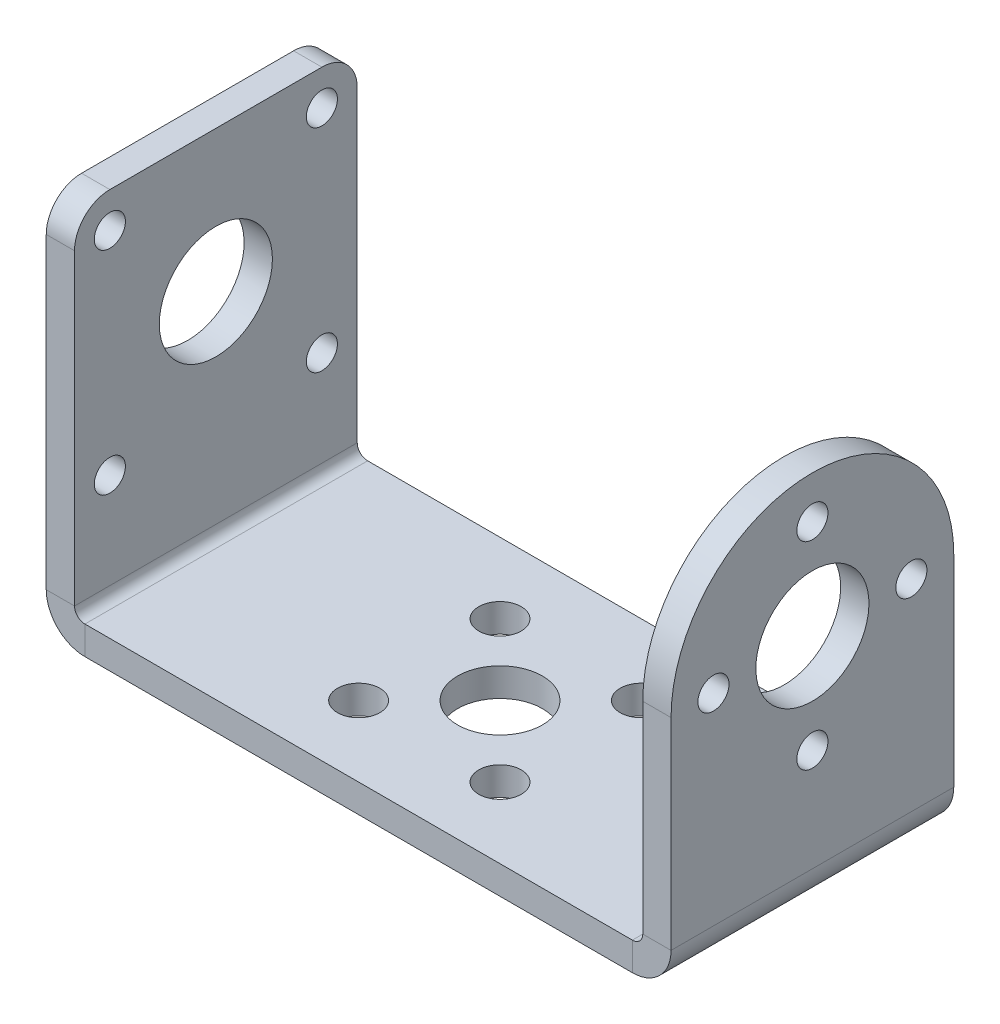
ISO-10303-21;
HEADER;
FILE_DESCRIPTION(('STEP AP214'),'2;1');
FILE_NAME('part.step','',(''),(''),'','','');
FILE_SCHEMA(('AUTOMOTIVE_DESIGN { 1 0 10303 214 1 1 1 1 }'));
ENDSEC;
DATA;
#1=APPLICATION_CONTEXT('core data for automotive mechanical design processes');
#2=APPLICATION_PROTOCOL_DEFINITION('international standard','automotive_design',2000,#1);
#3=PRODUCT_CONTEXT('',#1,'mechanical');
#4=PRODUCT('Part','Part','',(#3));
#5=PRODUCT_RELATED_PRODUCT_CATEGORY('part','',(#4));
#6=PRODUCT_DEFINITION_FORMATION('','',#4);
#7=PRODUCT_DEFINITION_CONTEXT('part definition',#1,'design');
#8=PRODUCT_DEFINITION('design','',#6,#7);
#9=PRODUCT_DEFINITION_SHAPE('','',#8);
#10=(LENGTH_UNIT() NAMED_UNIT(*) SI_UNIT(.MILLI.,.METRE.));
#11=(NAMED_UNIT(*) PLANE_ANGLE_UNIT() SI_UNIT($,.RADIAN.));
#12=(NAMED_UNIT(*) SI_UNIT($,.STERADIAN.) SOLID_ANGLE_UNIT());
#13=UNCERTAINTY_MEASURE_WITH_UNIT(LENGTH_MEASURE(1.E-05),#10,'distance_accuracy_value','');
#14=(GEOMETRIC_REPRESENTATION_CONTEXT(3) GLOBAL_UNCERTAINTY_ASSIGNED_CONTEXT((#13)) GLOBAL_UNIT_ASSIGNED_CONTEXT((#10,
#11,#12)) REPRESENTATION_CONTEXT('',''));
#15=CARTESIAN_POINT('',(0.,0.,0.));
#16=DIRECTION('',(0.,0.,1.));
#17=DIRECTION('',(1.,0.,0.));
#18=AXIS2_PLACEMENT_3D('',#15,#16,#17);
#19=CARTESIAN_POINT('',(-22.1000000000001,22.5,7.5));
#20=DIRECTION('',(1.,0.,0.));
#21=DIRECTION('',(0.,1.,0.));
#22=AXIS2_PLACEMENT_3D('',#19,#20,#21);
#23=CYLINDRICAL_SURFACE('',#22,2.5);
#24=DIRECTION('',(1.,0.,0.));
#25=VECTOR('',#24,1.);
#26=CARTESIAN_POINT('',(-22.1000000000001,25.,7.5));
#27=LINE('',#26,#25);
#28=CARTESIAN_POINT('',(-22.1000000000001,25.,7.5));
#29=VERTEX_POINT('',#28);
#30=CARTESIAN_POINT('',(-20.1000000000001,25.,7.5));
#31=VERTEX_POINT('',#30);
#32=EDGE_CURVE('E382',#29,#31,#27,.T.);
#33=ORIENTED_EDGE('',*,*,#32,.F.);
#34=CARTESIAN_POINT('',(-22.1000000000001,22.5,7.5));
#35=DIRECTION('',(1.,0.,0.));
#36=DIRECTION('',(0.,1.,0.));
#37=AXIS2_PLACEMENT_3D('',#34,#35,#36);
#38=CIRCLE('',#37,2.5);
#39=CARTESIAN_POINT('',(-22.1000000000001,22.5,10.));
#40=VERTEX_POINT('',#39);
#41=EDGE_CURVE('E155',#40,#29,#38,.F.);
#42=ORIENTED_EDGE('',*,*,#41,.F.);
#43=DIRECTION('',(1.,0.,0.));
#44=VECTOR('',#43,1.);
#45=CARTESIAN_POINT('',(-22.1000000000001,22.5,10.));
#46=LINE('',#45,#44);
#47=CARTESIAN_POINT('',(-20.1000000000001,22.5,10.));
#48=VERTEX_POINT('',#47);
#49=EDGE_CURVE('E385',#48,#40,#46,.F.);
#50=ORIENTED_EDGE('',*,*,#49,.F.);
#51=CARTESIAN_POINT('',(-20.1000000000001,22.5,7.5));
#52=DIRECTION('',(1.,0.,0.));
#53=DIRECTION('',(0.,1.,0.));
#54=AXIS2_PLACEMENT_3D('',#51,#52,#53);
#55=CIRCLE('',#54,2.5);
#56=EDGE_CURVE('E13',#31,#48,#55,.T.);
#57=ORIENTED_EDGE('',*,*,#56,.F.);
#58=EDGE_LOOP('',(#33,#42,#50,#57));
#59=FACE_BOUND('',#58,.T.);
#60=ADVANCED_FACE('F148',(#59),#23,.T.);
#61=CARTESIAN_POINT('',(-22.1000000000001,22.5,-7.5));
#62=DIRECTION('',(-1.,0.,0.));
#63=DIRECTION('',(0.,-1.,0.));
#64=AXIS2_PLACEMENT_3D('',#61,#62,#63);
#65=CYLINDRICAL_SURFACE('',#64,2.5);
#66=DIRECTION('',(-1.,0.,0.));
#67=VECTOR('',#66,1.);
#68=CARTESIAN_POINT('',(-22.1000000000001,25.,-7.5));
#69=LINE('',#68,#67);
#70=CARTESIAN_POINT('',(-20.1000000000001,25.,-7.5));
#71=VERTEX_POINT('',#70);
#72=CARTESIAN_POINT('',(-22.1000000000001,25.,-7.5));
#73=VERTEX_POINT('',#72);
#74=EDGE_CURVE('E368',#71,#73,#69,.T.);
#75=ORIENTED_EDGE('',*,*,#74,.F.);
#76=CARTESIAN_POINT('',(-20.1000000000001,22.5,-7.5));
#77=DIRECTION('',(1.,0.,0.));
#78=DIRECTION('',(0.,1.,0.));
#79=AXIS2_PLACEMENT_3D('',#76,#77,#78);
#80=CIRCLE('',#79,2.5);
#81=CARTESIAN_POINT('',(-20.1000000000001,22.5,-10.));
#82=VERTEX_POINT('',#81);
#83=EDGE_CURVE('E377',#82,#71,#80,.T.);
#84=ORIENTED_EDGE('',*,*,#83,.F.);
#85=DIRECTION('',(-1.,0.,0.));
#86=VECTOR('',#85,1.);
#87=CARTESIAN_POINT('',(-22.1000000000001,22.5,-10.));
#88=LINE('',#87,#86);
#89=CARTESIAN_POINT('',(-22.1000000000001,22.5,-10.));
#90=VERTEX_POINT('',#89);
#91=EDGE_CURVE('E374',#90,#82,#88,.F.);
#92=ORIENTED_EDGE('',*,*,#91,.F.);
#93=CARTESIAN_POINT('',(-22.1000000000001,22.5,-7.5));
#94=DIRECTION('',(1.,0.,0.));
#95=DIRECTION('',(0.,1.,0.));
#96=AXIS2_PLACEMENT_3D('',#93,#94,#95);
#97=CIRCLE('',#96,2.5);
#98=EDGE_CURVE('E380',#73,#90,#97,.F.);
#99=ORIENTED_EDGE('',*,*,#98,.F.);
#100=EDGE_LOOP('',(#75,#84,#92,#99));
#101=FACE_BOUND('',#100,.T.);
#102=ADVANCED_FACE('F396',(#101),#65,.T.);
#103=CARTESIAN_POINT('',(22.1,0.,0.));
#104=DIRECTION('',(1.,0.,0.));
#105=DIRECTION('',(0.,1.,0.));
#106=AXIS2_PLACEMENT_3D('',#103,#104,#105);
#107=PLANE('',#106);
#108=CARTESIAN_POINT('',(22.1000000000001,15.,-7.));
#109=DIRECTION('',(1.,0.,0.));
#110=DIRECTION('',(0.,1.,0.));
#111=AXIS2_PLACEMENT_3D('',#108,#109,#110);
#112=CIRCLE('',#111,1.1);
#113=CARTESIAN_POINT('',(22.1000000000001,16.1,-7.));
#114=VERTEX_POINT('',#113);
#115=EDGE_CURVE('E885',#114,#114,#112,.T.);
#116=ORIENTED_EDGE('',*,*,#115,.F.);
#117=EDGE_LOOP('',(#116));
#118=FACE_BOUND('',#117,.T.);
#119=CARTESIAN_POINT('',(22.1000000000001,22.,0.));
#120=DIRECTION('',(1.,0.,0.));
#121=DIRECTION('',(0.,1.,0.));
#122=AXIS2_PLACEMENT_3D('',#119,#120,#121);
#123=CIRCLE('',#122,1.1);
#124=CARTESIAN_POINT('',(22.1000000000001,23.1,0.));
#125=VERTEX_POINT('',#124);
#126=EDGE_CURVE('E891',#125,#125,#123,.T.);
#127=ORIENTED_EDGE('',*,*,#126,.F.);
#128=EDGE_LOOP('',(#127));
#129=FACE_BOUND('',#128,.T.);
#130=CARTESIAN_POINT('',(22.1000000000001,15.,0.));
#131=DIRECTION('',(1.,0.,0.));
#132=DIRECTION('',(0.,1.,0.));
#133=AXIS2_PLACEMENT_3D('',#130,#131,#132);
#134=CIRCLE('',#133,4.);
#135=CARTESIAN_POINT('',(22.1000000000001,19.,0.));
#136=VERTEX_POINT('',#135);
#137=EDGE_CURVE('E897',#136,#136,#134,.T.);
#138=ORIENTED_EDGE('',*,*,#137,.F.);
#139=EDGE_LOOP('',(#138));
#140=FACE_BOUND('',#139,.T.);
#141=CARTESIAN_POINT('',(22.1000000000001,15.,7.));
#142=DIRECTION('',(1.,0.,0.));
#143=DIRECTION('',(0.,1.,0.));
#144=AXIS2_PLACEMENT_3D('',#141,#142,#143);
#145=CIRCLE('',#144,1.1);
#146=CARTESIAN_POINT('',(22.1000000000001,16.1,7.));
#147=VERTEX_POINT('',#146);
#148=EDGE_CURVE('E880',#147,#147,#145,.T.);
#149=ORIENTED_EDGE('',*,*,#148,.F.);
#150=EDGE_LOOP('',(#149));
#151=FACE_BOUND('',#150,.T.);
#152=CARTESIAN_POINT('',(22.1,8.,0.));
#153=DIRECTION('',(1.,0.,0.));
#154=DIRECTION('',(0.,1.,0.));
#155=AXIS2_PLACEMENT_3D('',#152,#153,#154);
#156=CIRCLE('',#155,1.1);
#157=CARTESIAN_POINT('',(22.1,9.1,0.));
#158=VERTEX_POINT('',#157);
#159=EDGE_CURVE('E884',#158,#158,#156,.T.);
#160=ORIENTED_EDGE('',*,*,#159,.F.);
#161=EDGE_LOOP('',(#160));
#162=FACE_BOUND('',#161,.T.);
#163=DIRECTION('',(0.,-1.,0.));
#164=VECTOR('',#163,1.);
#165=CARTESIAN_POINT('',(22.1,0.,-10.));
#166=LINE('',#165,#164);
#167=CARTESIAN_POINT('',(22.1,0.73659999999999,-10.));
#168=VERTEX_POINT('',#167);
#169=CARTESIAN_POINT('',(22.1000000000001,15.,-10.));
#170=VERTEX_POINT('',#169);
#171=EDGE_CURVE('E262',#168,#170,#166,.F.);
#172=ORIENTED_EDGE('',*,*,#171,.T.);
#173=CARTESIAN_POINT('',(22.1000000000001,15.,0.));
#174=DIRECTION('',(1.,0.,0.));
#175=DIRECTION('',(0.,1.,0.));
#176=AXIS2_PLACEMENT_3D('',#173,#174,#175);
#177=CIRCLE('',#176,10.);
#178=CARTESIAN_POINT('',(22.1000000000001,15.,10.));
#179=VERTEX_POINT('',#178);
#180=EDGE_CURVE('E246',#179,#170,#177,.F.);
#181=ORIENTED_EDGE('',*,*,#180,.F.);
#182=DIRECTION('',(0.,1.,0.));
#183=VECTOR('',#182,1.);
#184=CARTESIAN_POINT('',(22.1,0.,10.));
#185=LINE('',#184,#183);
#186=CARTESIAN_POINT('',(22.1,0.73659999999999,10.));
#187=VERTEX_POINT('',#186);
#188=EDGE_CURVE('E271',#179,#187,#185,.F.);
#189=ORIENTED_EDGE('',*,*,#188,.T.);
#190=DIRECTION('',(0.,0.,-1.));
#191=VECTOR('',#190,1.);
#192=CARTESIAN_POINT('',(22.1,0.73659999999999,0.));
#193=LINE('',#192,#191);
#194=EDGE_CURVE('E270',#187,#168,#193,.T.);
#195=ORIENTED_EDGE('',*,*,#194,.T.);
#196=EDGE_LOOP('',(#172,#181,#189,#195));
#197=FACE_BOUND('',#196,.T.);
#198=ADVANCED_FACE('F268',(#118,#129,#140,#151,#162,#197),#107,.T.);
#199=CARTESIAN_POINT('',(20.1,0.,0.));
#200=DIRECTION('',(1.,0.,0.));
#201=DIRECTION('',(0.,1.,0.));
#202=AXIS2_PLACEMENT_3D('',#199,#200,#201);
#203=PLANE('',#202);
#204=CARTESIAN_POINT('',(20.1000000000001,15.,-7.));
#205=DIRECTION('',(1.,0.,0.));
#206=DIRECTION('',(0.,1.,0.));
#207=AXIS2_PLACEMENT_3D('',#204,#205,#206);
#208=CIRCLE('',#207,1.1);
#209=CARTESIAN_POINT('',(20.1000000000001,16.1,-7.));
#210=VERTEX_POINT('',#209);
#211=EDGE_CURVE('E881',#210,#210,#208,.T.);
#212=ORIENTED_EDGE('',*,*,#211,.T.);
#213=EDGE_LOOP('',(#212));
#214=FACE_BOUND('',#213,.T.);
#215=CARTESIAN_POINT('',(20.1000000000001,22.,0.));
#216=DIRECTION('',(1.,0.,0.));
#217=DIRECTION('',(0.,1.,0.));
#218=AXIS2_PLACEMENT_3D('',#215,#216,#217);
#219=CIRCLE('',#218,1.1);
#220=CARTESIAN_POINT('',(20.1000000000001,23.1,0.));
#221=VERTEX_POINT('',#220);
#222=EDGE_CURVE('E888',#221,#221,#219,.T.);
#223=ORIENTED_EDGE('',*,*,#222,.T.);
#224=EDGE_LOOP('',(#223));
#225=FACE_BOUND('',#224,.T.);
#226=CARTESIAN_POINT('',(20.1000000000001,15.,0.));
#227=DIRECTION('',(1.,0.,0.));
#228=DIRECTION('',(0.,1.,0.));
#229=AXIS2_PLACEMENT_3D('',#226,#227,#228);
#230=CIRCLE('',#229,4.);
#231=CARTESIAN_POINT('',(20.1000000000001,19.,0.));
#232=VERTEX_POINT('',#231);
#233=EDGE_CURVE('E894',#232,#232,#230,.T.);
#234=ORIENTED_EDGE('',*,*,#233,.T.);
#235=EDGE_LOOP('',(#234));
#236=FACE_BOUND('',#235,.T.);
#237=CARTESIAN_POINT('',(20.1000000000001,15.,7.));
#238=DIRECTION('',(1.,0.,0.));
#239=DIRECTION('',(0.,1.,0.));
#240=AXIS2_PLACEMENT_3D('',#237,#238,#239);
#241=CIRCLE('',#240,1.1);
#242=CARTESIAN_POINT('',(20.1000000000001,16.1,7.));
#243=VERTEX_POINT('',#242);
#244=EDGE_CURVE('E900',#243,#243,#241,.T.);
#245=ORIENTED_EDGE('',*,*,#244,.T.);
#246=EDGE_LOOP('',(#245));
#247=FACE_BOUND('',#246,.T.);
#248=CARTESIAN_POINT('',(20.1,8.00000000000001,0.));
#249=DIRECTION('',(1.,0.,0.));
#250=DIRECTION('',(0.,1.,0.));
#251=AXIS2_PLACEMENT_3D('',#248,#249,#250);
#252=CIRCLE('',#251,1.1);
#253=CARTESIAN_POINT('',(20.1,9.10000000000001,0.));
#254=VERTEX_POINT('',#253);
#255=EDGE_CURVE('E289',#254,#254,#252,.T.);
#256=ORIENTED_EDGE('',*,*,#255,.T.);
#257=EDGE_LOOP('',(#256));
#258=FACE_BOUND('',#257,.T.);
#259=CARTESIAN_POINT('',(20.1000000000001,15.,0.));
#260=DIRECTION('',(1.,0.,0.));
#261=DIRECTION('',(0.,1.,0.));
#262=AXIS2_PLACEMENT_3D('',#259,#260,#261);
#263=CIRCLE('',#262,10.);
#264=CARTESIAN_POINT('',(20.1000000000001,15.,10.));
#265=VERTEX_POINT('',#264);
#266=CARTESIAN_POINT('',(20.1000000000001,15.,-10.));
#267=VERTEX_POINT('',#266);
#268=EDGE_CURVE('E256',#265,#267,#263,.F.);
#269=ORIENTED_EDGE('',*,*,#268,.T.);
#270=DIRECTION('',(0.,1.,0.));
#271=VECTOR('',#270,1.);
#272=CARTESIAN_POINT('',(20.1,0.,-10.));
#273=LINE('',#272,#271);
#274=CARTESIAN_POINT('',(20.1,0.736599999999997,-10.));
#275=VERTEX_POINT('',#274);
#276=EDGE_CURVE('E264',#275,#267,#273,.T.);
#277=ORIENTED_EDGE('',*,*,#276,.F.);
#278=DIRECTION('',(0.,0.,1.));
#279=VECTOR('',#278,1.);
#280=CARTESIAN_POINT('',(20.1,0.736599999999997,10.));
#281=LINE('',#280,#279);
#282=CARTESIAN_POINT('',(20.1,0.736599999999997,10.));
#283=VERTEX_POINT('',#282);
#284=EDGE_CURVE('E284',#283,#275,#281,.F.);
#285=ORIENTED_EDGE('',*,*,#284,.F.);
#286=DIRECTION('',(0.,-1.,0.));
#287=VECTOR('',#286,1.);
#288=CARTESIAN_POINT('',(20.1000000000001,25.,10.));
#289=LINE('',#288,#287);
#290=EDGE_CURVE('E272',#265,#283,#289,.T.);
#291=ORIENTED_EDGE('',*,*,#290,.F.);
#292=EDGE_LOOP('',(#269,#277,#285,#291));
#293=FACE_BOUND('',#292,.T.);
#294=ADVANCED_FACE('F439',(#214,#225,#236,#247,#258,#293),#203,.F.);
#295=CARTESIAN_POINT('',(22.1000000000001,25.,10.));
#296=DIRECTION('',(0.,0.,-1.));
#297=DIRECTION('',(-1.,0.,0.));
#298=AXIS2_PLACEMENT_3D('',#295,#296,#297);
#299=PLANE('',#298);
#300=DIRECTION('',(-1.,0.,0.));
#301=VECTOR('',#300,1.);
#302=CARTESIAN_POINT('',(20.1000000000001,15.,10.));
#303=LINE('',#302,#301);
#304=EDGE_CURVE('E252',#265,#179,#303,.F.);
#305=ORIENTED_EDGE('',*,*,#304,.F.);
#306=ORIENTED_EDGE('',*,*,#290,.T.);
#307=DIRECTION('',(-1.,0.,0.));
#308=VECTOR('',#307,1.);
#309=CARTESIAN_POINT('',(22.1,0.73659999999999,10.));
#310=LINE('',#309,#308);
#311=EDGE_CURVE('E286',#283,#187,#310,.F.);
#312=ORIENTED_EDGE('',*,*,#311,.T.);
#313=ORIENTED_EDGE('',*,*,#188,.F.);
#314=EDGE_LOOP('',(#305,#306,#312,#313));
#315=FACE_BOUND('',#314,.T.);
#316=ADVANCED_FACE('F458',(#315),#299,.F.);
#317=CARTESIAN_POINT('',(0.,-2.,0.));
#318=DIRECTION('',(0.,1.,0.));
#319=DIRECTION('',(0.,0.,1.));
#320=AXIS2_PLACEMENT_3D('',#317,#318,#319);
#321=PLANE('',#320);
#322=CARTESIAN_POINT('',(-5.,-2.,5.));
#323=DIRECTION('',(0.,-1.,0.));
#324=DIRECTION('',(0.,0.,-1.));
#325=AXIS2_PLACEMENT_3D('',#322,#323,#324);
#326=CIRCLE('',#325,1.5);
#327=CARTESIAN_POINT('',(-5.,-2.,3.5));
#328=VERTEX_POINT('',#327);
#329=EDGE_CURVE('E821',#328,#328,#326,.T.);
#330=ORIENTED_EDGE('',*,*,#329,.F.);
#331=EDGE_LOOP('',(#330));
#332=FACE_BOUND('',#331,.T.);
#333=CARTESIAN_POINT('',(4.99999999999942,-2.,5.00000000000289));
#334=DIRECTION('',(0.,-1.,0.));
#335=DIRECTION('',(0.,0.,-1.));
#336=AXIS2_PLACEMENT_3D('',#333,#334,#335);
#337=CIRCLE('',#336,1.5);
#338=CARTESIAN_POINT('',(4.99999999999942,-2.,3.50000000000289));
#339=VERTEX_POINT('',#338);
#340=EDGE_CURVE('E827',#339,#339,#337,.T.);
#341=ORIENTED_EDGE('',*,*,#340,.F.);
#342=EDGE_LOOP('',(#341));
#343=FACE_BOUND('',#342,.T.);
#344=CARTESIAN_POINT('',(5.00000000000231,-2.,-4.99999999999653));
#345=DIRECTION('',(0.,-1.,0.));
#346=DIRECTION('',(0.,0.,-1.));
#347=AXIS2_PLACEMENT_3D('',#344,#345,#346);
#348=CIRCLE('',#347,1.5);
#349=CARTESIAN_POINT('',(5.00000000000231,-2.,-6.49999999999653));
#350=VERTEX_POINT('',#349);
#351=EDGE_CURVE('E835',#350,#350,#348,.T.);
#352=ORIENTED_EDGE('',*,*,#351,.F.);
#353=EDGE_LOOP('',(#352));
#354=FACE_BOUND('',#353,.T.);
#355=CARTESIAN_POINT('',(-4.99999999999711,-2.,-4.99999999999942));
#356=DIRECTION('',(0.,-1.,0.));
#357=DIRECTION('',(0.,0.,-1.));
#358=AXIS2_PLACEMENT_3D('',#355,#356,#357);
#359=CIRCLE('',#358,1.5);
#360=CARTESIAN_POINT('',(-4.99999999999711,-2.,-6.49999999999942));
#361=VERTEX_POINT('',#360);
#362=EDGE_CURVE('E841',#361,#361,#359,.T.);
#363=ORIENTED_EDGE('',*,*,#362,.F.);
#364=EDGE_LOOP('',(#363));
#365=FACE_BOUND('',#364,.T.);
#366=CARTESIAN_POINT('',(0.,-2.,0.));
#367=DIRECTION('',(0.,-1.,0.));
#368=DIRECTION('',(0.,0.,-1.));
#369=AXIS2_PLACEMENT_3D('',#366,#367,#368);
#370=CIRCLE('',#369,3.);
#371=CARTESIAN_POINT('',(0.,-2.,-3.));
#372=VERTEX_POINT('',#371);
#373=EDGE_CURVE('E825',#372,#372,#370,.T.);
#374=ORIENTED_EDGE('',*,*,#373,.F.);
#375=EDGE_LOOP('',(#374));
#376=FACE_BOUND('',#375,.T.);
#377=DIRECTION('',(0.,0.,-1.));
#378=VECTOR('',#377,1.);
#379=CARTESIAN_POINT('',(19.3634,-2.,-10.));
#380=LINE('',#379,#378);
#381=CARTESIAN_POINT('',(19.3634,-2.,-10.));
#382=VERTEX_POINT('',#381);
#383=CARTESIAN_POINT('',(19.3634,-2.,10.));
#384=VERTEX_POINT('',#383);
#385=EDGE_CURVE('E290',#382,#384,#380,.F.);
#386=ORIENTED_EDGE('',*,*,#385,.T.);
#387=DIRECTION('',(1.,0.,0.));
#388=VECTOR('',#387,1.);
#389=CARTESIAN_POINT('',(-22.1,-2.,10.));
#390=LINE('',#389,#388);
#391=CARTESIAN_POINT('',(-19.3634,-2.,10.));
#392=VERTEX_POINT('',#391);
#393=EDGE_CURVE('E364',#392,#384,#390,.T.);
#394=ORIENTED_EDGE('',*,*,#393,.F.);
#395=DIRECTION('',(0.,0.,1.));
#396=VECTOR('',#395,1.);
#397=CARTESIAN_POINT('',(-19.3634,-2.,10.));
#398=LINE('',#397,#396);
#399=CARTESIAN_POINT('',(-19.3634,-2.,-10.));
#400=VERTEX_POINT('',#399);
#401=EDGE_CURVE('E338',#392,#400,#398,.F.);
#402=ORIENTED_EDGE('',*,*,#401,.T.);
#403=DIRECTION('',(-1.,0.,0.));
#404=VECTOR('',#403,1.);
#405=CARTESIAN_POINT('',(-22.1,-2.,-10.));
#406=LINE('',#405,#404);
#407=EDGE_CURVE('E362',#382,#400,#406,.T.);
#408=ORIENTED_EDGE('',*,*,#407,.F.);
#409=EDGE_LOOP('',(#386,#394,#402,#408));
#410=FACE_BOUND('',#409,.T.);
#411=ADVANCED_FACE('F454',(#332,#343,#354,#365,#376,#410),#321,.F.);
#412=CARTESIAN_POINT('',(0.,0.,0.));
#413=DIRECTION('',(0.,1.,0.));
#414=DIRECTION('',(0.,0.,1.));
#415=AXIS2_PLACEMENT_3D('',#412,#413,#414);
#416=PLANE('',#415);
#417=CARTESIAN_POINT('',(-5.,0.,5.));
#418=DIRECTION('',(0.,1.,0.));
#419=DIRECTION('',(0.,0.,1.));
#420=AXIS2_PLACEMENT_3D('',#417,#418,#419);
#421=CIRCLE('',#420,1.5);
#422=CARTESIAN_POINT('',(-5.,0.,6.5));
#423=VERTEX_POINT('',#422);
#424=EDGE_CURVE('E818',#423,#423,#421,.F.);
#425=ORIENTED_EDGE('',*,*,#424,.T.);
#426=EDGE_LOOP('',(#425));
#427=FACE_BOUND('',#426,.T.);
#428=CARTESIAN_POINT('',(4.99999999999942,0.,5.00000000000289));
#429=DIRECTION('',(0.,1.,0.));
#430=DIRECTION('',(0.,0.,1.));
#431=AXIS2_PLACEMENT_3D('',#428,#429,#430);
#432=CIRCLE('',#431,1.5);
#433=CARTESIAN_POINT('',(4.99999999999942,0.,6.50000000000289));
#434=VERTEX_POINT('',#433);
#435=EDGE_CURVE('E832',#434,#434,#432,.F.);
#436=ORIENTED_EDGE('',*,*,#435,.T.);
#437=EDGE_LOOP('',(#436));
#438=FACE_BOUND('',#437,.T.);
#439=CARTESIAN_POINT('',(5.00000000000231,0.,-4.99999999999653));
#440=DIRECTION('',(0.,1.,0.));
#441=DIRECTION('',(0.,0.,1.));
#442=AXIS2_PLACEMENT_3D('',#439,#440,#441);
#443=CIRCLE('',#442,1.5);
#444=CARTESIAN_POINT('',(5.00000000000231,0.,-3.49999999999653));
#445=VERTEX_POINT('',#444);
#446=EDGE_CURVE('E838',#445,#445,#443,.F.);
#447=ORIENTED_EDGE('',*,*,#446,.T.);
#448=EDGE_LOOP('',(#447));
#449=FACE_BOUND('',#448,.T.);
#450=CARTESIAN_POINT('',(-4.99999999999711,0.,-4.99999999999942));
#451=DIRECTION('',(0.,1.,0.));
#452=DIRECTION('',(0.,0.,1.));
#453=AXIS2_PLACEMENT_3D('',#450,#451,#452);
#454=CIRCLE('',#453,1.5);
#455=CARTESIAN_POINT('',(-4.99999999999711,0.,-3.49999999999942));
#456=VERTEX_POINT('',#455);
#457=EDGE_CURVE('E844',#456,#456,#454,.F.);
#458=ORIENTED_EDGE('',*,*,#457,.T.);
#459=EDGE_LOOP('',(#458));
#460=FACE_BOUND('',#459,.T.);
#461=CARTESIAN_POINT('',(0.,0.,0.));
#462=DIRECTION('',(0.,1.,0.));
#463=DIRECTION('',(0.,0.,1.));
#464=AXIS2_PLACEMENT_3D('',#461,#462,#463);
#465=CIRCLE('',#464,3.);
#466=CARTESIAN_POINT('',(0.,0.,3.));
#467=VERTEX_POINT('',#466);
#468=EDGE_CURVE('E822',#467,#467,#465,.F.);
#469=ORIENTED_EDGE('',*,*,#468,.T.);
#470=EDGE_LOOP('',(#469));
#471=FACE_BOUND('',#470,.T.);
#472=DIRECTION('',(1.,0.,0.));
#473=VECTOR('',#472,1.);
#474=CARTESIAN_POINT('',(-22.1,0.,10.));
#475=LINE('',#474,#473);
#476=CARTESIAN_POINT('',(-19.3634,0.,10.));
#477=VERTEX_POINT('',#476);
#478=CARTESIAN_POINT('',(19.3634,0.,10.));
#479=VERTEX_POINT('',#478);
#480=EDGE_CURVE('E365',#477,#479,#475,.T.);
#481=ORIENTED_EDGE('',*,*,#480,.T.);
#482=DIRECTION('',(0.,0.,-1.));
#483=VECTOR('',#482,1.);
#484=CARTESIAN_POINT('',(19.3634,0.,-10.));
#485=LINE('',#484,#483);
#486=CARTESIAN_POINT('',(19.3634,0.,-10.));
#487=VERTEX_POINT('',#486);
#488=EDGE_CURVE('E302',#487,#479,#485,.F.);
#489=ORIENTED_EDGE('',*,*,#488,.F.);
#490=DIRECTION('',(-1.,0.,0.));
#491=VECTOR('',#490,1.);
#492=CARTESIAN_POINT('',(-22.1,0.,-10.));
#493=LINE('',#492,#491);
#494=CARTESIAN_POINT('',(-19.3634,0.,-10.));
#495=VERTEX_POINT('',#494);
#496=EDGE_CURVE('E359',#487,#495,#493,.T.);
#497=ORIENTED_EDGE('',*,*,#496,.T.);
#498=DIRECTION('',(0.,0.,1.));
#499=VECTOR('',#498,1.);
#500=CARTESIAN_POINT('',(-19.3634,0.,10.));
#501=LINE('',#500,#499);
#502=EDGE_CURVE('E351',#477,#495,#501,.F.);
#503=ORIENTED_EDGE('',*,*,#502,.F.);
#504=EDGE_LOOP('',(#481,#489,#497,#503));
#505=FACE_BOUND('',#504,.T.);
#506=ADVANCED_FACE('F447',(#427,#438,#449,#460,#471,#505),#416,.T.);
#507=CARTESIAN_POINT('',(-22.1,-2.,-10.));
#508=DIRECTION('',(0.,0.,-1.));
#509=DIRECTION('',(-1.,0.,0.));
#510=AXIS2_PLACEMENT_3D('',#507,#508,#509);
#511=PLANE('',#510);
#512=ORIENTED_EDGE('',*,*,#496,.F.);
#513=DIRECTION('',(0.,-1.,0.));
#514=VECTOR('',#513,1.);
#515=CARTESIAN_POINT('',(19.3634,0.,-10.));
#516=LINE('',#515,#514);
#517=EDGE_CURVE('E296',#487,#382,#516,.T.);
#518=ORIENTED_EDGE('',*,*,#517,.T.);
#519=ORIENTED_EDGE('',*,*,#407,.T.);
#520=DIRECTION('',(0.,-1.,0.));
#521=VECTOR('',#520,1.);
#522=CARTESIAN_POINT('',(-19.3634,0.,-10.));
#523=LINE('',#522,#521);
#524=EDGE_CURVE('E356',#495,#400,#523,.T.);
#525=ORIENTED_EDGE('',*,*,#524,.F.);
#526=EDGE_LOOP('',(#512,#518,#519,#525));
#527=FACE_BOUND('',#526,.T.);
#528=ADVANCED_FACE('F443',(#527),#511,.T.);
#529=CARTESIAN_POINT('',(-22.1,-2.,10.));
#530=DIRECTION('',(0.,0.,1.));
#531=DIRECTION('',(1.,0.,0.));
#532=AXIS2_PLACEMENT_3D('',#529,#530,#531);
#533=PLANE('',#532);
#534=DIRECTION('',(0.,-1.,0.));
#535=VECTOR('',#534,1.);
#536=CARTESIAN_POINT('',(19.3634,0.,10.));
#537=LINE('',#536,#535);
#538=EDGE_CURVE('E307',#479,#384,#537,.T.);
#539=ORIENTED_EDGE('',*,*,#538,.F.);
#540=ORIENTED_EDGE('',*,*,#480,.F.);
#541=DIRECTION('',(0.,-1.,0.));
#542=VECTOR('',#541,1.);
#543=CARTESIAN_POINT('',(-19.3634,0.,10.));
#544=LINE('',#543,#542);
#545=EDGE_CURVE('E345',#477,#392,#544,.T.);
#546=ORIENTED_EDGE('',*,*,#545,.T.);
#547=ORIENTED_EDGE('',*,*,#393,.T.);
#548=EDGE_LOOP('',(#539,#540,#546,#547));
#549=FACE_BOUND('',#548,.T.);
#550=ADVANCED_FACE('F446',(#549),#533,.T.);
#551=CARTESIAN_POINT('',(-19.3634,0.7366,-10.));
#552=DIRECTION('',(0.,0.,-1.));
#553=DIRECTION('',(0.,1.,0.));
#554=AXIS2_PLACEMENT_3D('',#551,#552,#553);
#555=PLANE('',#554);
#556=DIRECTION('',(1.,0.,0.));
#557=VECTOR('',#556,1.);
#558=CARTESIAN_POINT('',(-22.1,0.73659999999999,-10.));
#559=LINE('',#558,#557);
#560=CARTESIAN_POINT('',(-20.1,0.736599999999997,-10.));
#561=VERTEX_POINT('',#560);
#562=CARTESIAN_POINT('',(-22.1,0.73659999999999,-10.));
#563=VERTEX_POINT('',#562);
#564=EDGE_CURVE('E310',#561,#563,#559,.F.);
#565=ORIENTED_EDGE('',*,*,#564,.F.);
#566=CARTESIAN_POINT('',(-19.3634,0.7366,-10.));
#567=DIRECTION('',(0.,0.,1.));
#568=DIRECTION('',(0.,-1.,0.));
#569=AXIS2_PLACEMENT_3D('',#566,#567,#568);
#570=CIRCLE('',#569,0.7366);
#571=EDGE_CURVE('E348',#495,#561,#570,.F.);
#572=ORIENTED_EDGE('',*,*,#571,.F.);
#573=ORIENTED_EDGE('',*,*,#524,.T.);
#574=CARTESIAN_POINT('',(-19.3634,0.7366,-10.));
#575=DIRECTION('',(0.,0.,1.));
#576=DIRECTION('',(0.,-1.,0.));
#577=AXIS2_PLACEMENT_3D('',#574,#575,#576);
#578=CIRCLE('',#577,2.7366);
#579=EDGE_CURVE('E341',#400,#563,#578,.F.);
#580=ORIENTED_EDGE('',*,*,#579,.T.);
#581=EDGE_LOOP('',(#565,#572,#573,#580));
#582=FACE_BOUND('',#581,.T.);
#583=ADVANCED_FACE('F406',(#582),#555,.T.);
#584=CARTESIAN_POINT('',(-19.3634,0.736599999999996,10.));
#585=DIRECTION('',(0.,0.,-1.));
#586=DIRECTION('',(0.,1.,0.));
#587=AXIS2_PLACEMENT_3D('',#584,#585,#586);
#588=PLANE('',#587);
#589=CARTESIAN_POINT('',(-19.3634,0.736599999999996,10.));
#590=DIRECTION('',(0.,0.,1.));
#591=DIRECTION('',(0.,-1.,0.));
#592=AXIS2_PLACEMENT_3D('',#589,#590,#591);
#593=CIRCLE('',#592,0.7366);
#594=CARTESIAN_POINT('',(-20.1,0.736599999999993,10.));
#595=VERTEX_POINT('',#594);
#596=EDGE_CURVE('E315',#595,#477,#593,.T.);
#597=ORIENTED_EDGE('',*,*,#596,.F.);
#598=DIRECTION('',(1.,0.,0.));
#599=VECTOR('',#598,1.);
#600=CARTESIAN_POINT('',(-20.1,0.736599999999993,10.));
#601=LINE('',#600,#599);
#602=CARTESIAN_POINT('',(-22.1,0.736599999999987,10.));
#603=VERTEX_POINT('',#602);
#604=EDGE_CURVE('E331',#595,#603,#601,.F.);
#605=ORIENTED_EDGE('',*,*,#604,.T.);
#606=CARTESIAN_POINT('',(-19.3634,0.736599999999996,10.));
#607=DIRECTION('',(0.,0.,1.));
#608=DIRECTION('',(0.,-1.,0.));
#609=AXIS2_PLACEMENT_3D('',#606,#607,#608);
#610=CIRCLE('',#609,2.7366);
#611=EDGE_CURVE('E342',#603,#392,#610,.T.);
#612=ORIENTED_EDGE('',*,*,#611,.T.);
#613=ORIENTED_EDGE('',*,*,#545,.F.);
#614=EDGE_LOOP('',(#597,#605,#612,#613));
#615=FACE_BOUND('',#614,.T.);
#616=ADVANCED_FACE('F419',(#615),#588,.F.);
#617=CARTESIAN_POINT('',(-19.3634,0.736599999999996,10.));
#618=DIRECTION('',(0.,0.,1.));
#619=DIRECTION('',(-1.,0.,0.));
#620=AXIS2_PLACEMENT_3D('',#617,#618,#619);
#621=CYLINDRICAL_SURFACE('',#620,2.7366);
#622=ORIENTED_EDGE('',*,*,#401,.F.);
#623=ORIENTED_EDGE('',*,*,#611,.F.);
#624=DIRECTION('',(0.,0.,1.));
#625=VECTOR('',#624,1.);
#626=CARTESIAN_POINT('',(-22.1,0.73659999999999,-10.));
#627=LINE('',#626,#625);
#628=EDGE_CURVE('E328',#603,#563,#627,.F.);
#629=ORIENTED_EDGE('',*,*,#628,.T.);
#630=ORIENTED_EDGE('',*,*,#579,.F.);
#631=EDGE_LOOP('',(#622,#623,#629,#630));
#632=FACE_BOUND('',#631,.T.);
#633=ADVANCED_FACE('F403',(#632),#621,.T.);
#634=CARTESIAN_POINT('',(-19.3634,0.736599999999996,10.));
#635=DIRECTION('',(0.,0.,1.));
#636=DIRECTION('',(-1.,0.,0.));
#637=AXIS2_PLACEMENT_3D('',#634,#635,#636);
#638=CYLINDRICAL_SURFACE('',#637,0.7366);
#639=ORIENTED_EDGE('',*,*,#502,.T.);
#640=ORIENTED_EDGE('',*,*,#571,.T.);
#641=DIRECTION('',(0.,0.,1.));
#642=VECTOR('',#641,1.);
#643=CARTESIAN_POINT('',(-20.1,0.736599999999997,-10.));
#644=LINE('',#643,#642);
#645=EDGE_CURVE('E334',#561,#595,#644,.T.);
#646=ORIENTED_EDGE('',*,*,#645,.T.);
#647=ORIENTED_EDGE('',*,*,#596,.T.);
#648=EDGE_LOOP('',(#639,#640,#646,#647));
#649=FACE_BOUND('',#648,.T.);
#650=ADVANCED_FACE('F415',(#649),#638,.F.);
#651=CARTESIAN_POINT('',(-22.1000000000001,25.,10.));
#652=DIRECTION('',(0.,0.,-1.));
#653=DIRECTION('',(-1.,0.,0.));
#654=AXIS2_PLACEMENT_3D('',#651,#652,#653);
#655=PLANE('',#654);
#656=DIRECTION('',(0.,-1.,0.));
#657=VECTOR('',#656,1.);
#658=CARTESIAN_POINT('',(-20.1000000000001,25.,10.));
#659=LINE('',#658,#657);
#660=EDGE_CURVE('E325',#595,#48,#659,.F.);
#661=ORIENTED_EDGE('',*,*,#660,.T.);
#662=ORIENTED_EDGE('',*,*,#49,.T.);
#663=DIRECTION('',(0.,1.,0.));
#664=VECTOR('',#663,1.);
#665=CARTESIAN_POINT('',(-22.1,0.,10.));
#666=LINE('',#665,#664);
#667=EDGE_CURVE('E318',#603,#40,#666,.T.);
#668=ORIENTED_EDGE('',*,*,#667,.F.);
#669=ORIENTED_EDGE('',*,*,#604,.F.);
#670=EDGE_LOOP('',(#661,#662,#668,#669));
#671=FACE_BOUND('',#670,.T.);
#672=ADVANCED_FACE('F421',(#671),#655,.F.);
#673=CARTESIAN_POINT('',(-22.1,0.,-10.));
#674=DIRECTION('',(0.,0.,1.));
#675=DIRECTION('',(1.,0.,0.));
#676=AXIS2_PLACEMENT_3D('',#673,#674,#675);
#677=PLANE('',#676);
#678=DIRECTION('',(0.,-1.,0.));
#679=VECTOR('',#678,1.);
#680=CARTESIAN_POINT('',(-22.1,0.,-10.));
#681=LINE('',#680,#679);
#682=EDGE_CURVE('E313',#90,#563,#681,.T.);
#683=ORIENTED_EDGE('',*,*,#682,.F.);
#684=ORIENTED_EDGE('',*,*,#91,.T.);
#685=DIRECTION('',(0.,1.,0.));
#686=VECTOR('',#685,1.);
#687=CARTESIAN_POINT('',(-20.1,0.,-10.));
#688=LINE('',#687,#686);
#689=EDGE_CURVE('E321',#82,#561,#688,.F.);
#690=ORIENTED_EDGE('',*,*,#689,.T.);
#691=ORIENTED_EDGE('',*,*,#564,.T.);
#692=EDGE_LOOP('',(#683,#684,#690,#691));
#693=FACE_BOUND('',#692,.T.);
#694=ADVANCED_FACE('F409',(#693),#677,.F.);
#695=CARTESIAN_POINT('',(-22.1,0.,0.));
#696=DIRECTION('',(1.,0.,0.));
#697=DIRECTION('',(0.,1.,0.));
#698=AXIS2_PLACEMENT_3D('',#695,#696,#697);
#699=PLANE('',#698);
#700=CARTESIAN_POINT('',(-22.1000000000001,22.5,-7.5));
#701=DIRECTION('',(-1.,0.,0.));
#702=DIRECTION('',(0.,-1.,0.));
#703=AXIS2_PLACEMENT_3D('',#700,#701,#702);
#704=CIRCLE('',#703,1.1);
#705=CARTESIAN_POINT('',(-22.1000000000001,21.4,-7.5));
#706=VERTEX_POINT('',#705);
#707=EDGE_CURVE('E850',#706,#706,#704,.T.);
#708=ORIENTED_EDGE('',*,*,#707,.F.);
#709=EDGE_LOOP('',(#708));
#710=FACE_BOUND('',#709,.T.);
#711=CARTESIAN_POINT('',(-22.1000000000001,22.5000000000007,7.5));
#712=DIRECTION('',(-1.,0.,0.));
#713=DIRECTION('',(0.,-1.,0.));
#714=AXIS2_PLACEMENT_3D('',#711,#712,#713);
#715=CIRCLE('',#714,1.1);
#716=CARTESIAN_POINT('',(-22.1000000000001,21.4000000000007,7.5));
#717=VERTEX_POINT('',#716);
#718=EDGE_CURVE('E858',#717,#717,#715,.T.);
#719=ORIENTED_EDGE('',*,*,#718,.F.);
#720=EDGE_LOOP('',(#719));
#721=FACE_BOUND('',#720,.T.);
#722=CARTESIAN_POINT('',(-22.1,7.50000000000001,-7.49999999999929));
#723=DIRECTION('',(-1.,0.,0.));
#724=DIRECTION('',(0.,-1.,0.));
#725=AXIS2_PLACEMENT_3D('',#722,#723,#724);
#726=CIRCLE('',#725,1.1);
#727=CARTESIAN_POINT('',(-22.1,6.40000000000001,-7.49999999999929));
#728=VERTEX_POINT('',#727);
#729=EDGE_CURVE('E861',#728,#728,#726,.T.);
#730=ORIENTED_EDGE('',*,*,#729,.F.);
#731=EDGE_LOOP('',(#730));
#732=FACE_BOUND('',#731,.T.);
#733=CARTESIAN_POINT('',(-22.1,7.50000000000071,7.5000000000007));
#734=DIRECTION('',(-1.,0.,0.));
#735=DIRECTION('',(0.,-1.,0.));
#736=AXIS2_PLACEMENT_3D('',#733,#734,#735);
#737=CIRCLE('',#736,1.1);
#738=CARTESIAN_POINT('',(-22.1,6.40000000000071,7.5000000000007));
#739=VERTEX_POINT('',#738);
#740=EDGE_CURVE('E869',#739,#739,#737,.T.);
#741=ORIENTED_EDGE('',*,*,#740,.F.);
#742=EDGE_LOOP('',(#741));
#743=FACE_BOUND('',#742,.T.);
#744=CARTESIAN_POINT('',(-22.1000000000001,15.,0.));
#745=DIRECTION('',(-1.,0.,0.));
#746=DIRECTION('',(0.,-1.,0.));
#747=AXIS2_PLACEMENT_3D('',#744,#745,#746);
#748=CIRCLE('',#747,4.);
#749=CARTESIAN_POINT('',(-22.1,11.,0.));
#750=VERTEX_POINT('',#749);
#751=EDGE_CURVE('E265',#750,#750,#748,.T.);
#752=ORIENTED_EDGE('',*,*,#751,.F.);
#753=EDGE_LOOP('',(#752));
#754=FACE_BOUND('',#753,.T.);
#755=ORIENTED_EDGE('',*,*,#667,.T.);
#756=ORIENTED_EDGE('',*,*,#41,.T.);
#757=DIRECTION('',(0.,0.,-1.));
#758=VECTOR('',#757,1.);
#759=CARTESIAN_POINT('',(-22.1000000000001,25.,0.));
#760=LINE('',#759,#758);
#761=EDGE_CURVE('E316',#29,#73,#760,.T.);
#762=ORIENTED_EDGE('',*,*,#761,.T.);
#763=ORIENTED_EDGE('',*,*,#98,.T.);
#764=ORIENTED_EDGE('',*,*,#682,.T.);
#765=ORIENTED_EDGE('',*,*,#628,.F.);
#766=EDGE_LOOP('',(#755,#756,#762,#763,#764,#765));
#767=FACE_BOUND('',#766,.T.);
#768=ADVANCED_FACE('F387',(#710,#721,#732,#743,#754,#767),#699,.F.);
#769=CARTESIAN_POINT('',(-20.1,0.,0.));
#770=DIRECTION('',(1.,0.,0.));
#771=DIRECTION('',(0.,1.,0.));
#772=AXIS2_PLACEMENT_3D('',#769,#770,#771);
#773=PLANE('',#772);
#774=CARTESIAN_POINT('',(-20.1000000000001,22.5,-7.5));
#775=DIRECTION('',(1.,0.,0.));
#776=DIRECTION('',(0.,1.,0.));
#777=AXIS2_PLACEMENT_3D('',#774,#775,#776);
#778=CIRCLE('',#777,1.1);
#779=CARTESIAN_POINT('',(-20.1000000000001,23.6,-7.5));
#780=VERTEX_POINT('',#779);
#781=EDGE_CURVE('E853',#780,#780,#778,.F.);
#782=ORIENTED_EDGE('',*,*,#781,.T.);
#783=EDGE_LOOP('',(#782));
#784=FACE_BOUND('',#783,.T.);
#785=CARTESIAN_POINT('',(-20.1000000000001,22.5000000000007,7.49999999999999));
#786=DIRECTION('',(1.,0.,0.));
#787=DIRECTION('',(0.,1.,0.));
#788=AXIS2_PLACEMENT_3D('',#785,#786,#787);
#789=CIRCLE('',#788,1.1);
#790=CARTESIAN_POINT('',(-20.1000000000001,23.6000000000007,7.49999999999999));
#791=VERTEX_POINT('',#790);
#792=EDGE_CURVE('E854',#791,#791,#789,.F.);
#793=ORIENTED_EDGE('',*,*,#792,.T.);
#794=EDGE_LOOP('',(#793));
#795=FACE_BOUND('',#794,.T.);
#796=CARTESIAN_POINT('',(-20.1,7.50000000000001,-7.49999999999929));
#797=DIRECTION('',(1.,0.,0.));
#798=DIRECTION('',(0.,1.,0.));
#799=AXIS2_PLACEMENT_3D('',#796,#797,#798);
#800=CIRCLE('',#799,1.1);
#801=CARTESIAN_POINT('',(-20.1,8.60000000000001,-7.49999999999929));
#802=VERTEX_POINT('',#801);
#803=EDGE_CURVE('E866',#802,#802,#800,.F.);
#804=ORIENTED_EDGE('',*,*,#803,.T.);
#805=EDGE_LOOP('',(#804));
#806=FACE_BOUND('',#805,.T.);
#807=CARTESIAN_POINT('',(-20.1,7.50000000000072,7.5000000000007));
#808=DIRECTION('',(1.,0.,0.));
#809=DIRECTION('',(0.,1.,0.));
#810=AXIS2_PLACEMENT_3D('',#807,#808,#809);
#811=CIRCLE('',#810,1.1);
#812=CARTESIAN_POINT('',(-20.1,8.60000000000072,7.5000000000007));
#813=VERTEX_POINT('',#812);
#814=EDGE_CURVE('E848',#813,#813,#811,.F.);
#815=ORIENTED_EDGE('',*,*,#814,.T.);
#816=EDGE_LOOP('',(#815));
#817=FACE_BOUND('',#816,.T.);
#818=CARTESIAN_POINT('',(-20.1000000000001,15.,0.));
#819=DIRECTION('',(1.,0.,0.));
#820=DIRECTION('',(0.,1.,0.));
#821=AXIS2_PLACEMENT_3D('',#818,#819,#820);
#822=CIRCLE('',#821,4.);
#823=CARTESIAN_POINT('',(-20.1000000000001,19.,0.));
#824=VERTEX_POINT('',#823);
#825=EDGE_CURVE('E857',#824,#824,#822,.F.);
#826=ORIENTED_EDGE('',*,*,#825,.T.);
#827=EDGE_LOOP('',(#826));
#828=FACE_BOUND('',#827,.T.);
#829=DIRECTION('',(0.,0.,1.));
#830=VECTOR('',#829,1.);
#831=CARTESIAN_POINT('',(-20.1000000000001,25.,-10.));
#832=LINE('',#831,#830);
#833=EDGE_CURVE('E323',#31,#71,#832,.F.);
#834=ORIENTED_EDGE('',*,*,#833,.F.);
#835=ORIENTED_EDGE('',*,*,#56,.T.);
#836=ORIENTED_EDGE('',*,*,#660,.F.);
#837=ORIENTED_EDGE('',*,*,#645,.F.);
#838=ORIENTED_EDGE('',*,*,#689,.F.);
#839=ORIENTED_EDGE('',*,*,#83,.T.);
#840=EDGE_LOOP('',(#834,#835,#836,#837,#838,#839));
#841=FACE_BOUND('',#840,.T.);
#842=ADVANCED_FACE('F412',(#784,#795,#806,#817,#828,#841),#773,.T.);
#843=CARTESIAN_POINT('',(-22.1000000000001,25.,-10.));
#844=DIRECTION('',(0.,-1.,0.));
#845=DIRECTION('',(1.,0.,0.));
#846=AXIS2_PLACEMENT_3D('',#843,#844,#845);
#847=PLANE('',#846);
#848=ORIENTED_EDGE('',*,*,#761,.F.);
#849=ORIENTED_EDGE('',*,*,#32,.T.);
#850=ORIENTED_EDGE('',*,*,#833,.T.);
#851=ORIENTED_EDGE('',*,*,#74,.T.);
#852=EDGE_LOOP('',(#848,#849,#850,#851));
#853=FACE_BOUND('',#852,.T.);
#854=ADVANCED_FACE('F393',(#853),#847,.F.);
#855=CARTESIAN_POINT('',(19.3634,0.7366,10.));
#856=DIRECTION('',(0.,0.,1.));
#857=DIRECTION('',(1.,0.,0.));
#858=AXIS2_PLACEMENT_3D('',#855,#856,#857);
#859=PLANE('',#858);
#860=ORIENTED_EDGE('',*,*,#311,.F.);
#861=CARTESIAN_POINT('',(19.3634,0.7366,10.));
#862=DIRECTION('',(0.,0.,-1.));
#863=DIRECTION('',(-1.,0.,0.));
#864=AXIS2_PLACEMENT_3D('',#861,#862,#863);
#865=CIRCLE('',#864,0.7366);
#866=EDGE_CURVE('E299',#479,#283,#865,.F.);
#867=ORIENTED_EDGE('',*,*,#866,.F.);
#868=ORIENTED_EDGE('',*,*,#538,.T.);
#869=CARTESIAN_POINT('',(19.3634,0.7366,10.));
#870=DIRECTION('',(0.,0.,-1.));
#871=DIRECTION('',(-1.,0.,0.));
#872=AXIS2_PLACEMENT_3D('',#869,#870,#871);
#873=CIRCLE('',#872,2.7366);
#874=EDGE_CURVE('E292',#384,#187,#873,.F.);
#875=ORIENTED_EDGE('',*,*,#874,.T.);
#876=EDGE_LOOP('',(#860,#867,#868,#875));
#877=FACE_BOUND('',#876,.T.);
#878=ADVANCED_FACE('F479',(#877),#859,.T.);
#879=CARTESIAN_POINT('',(19.3634,0.7366,-10.));
#880=DIRECTION('',(0.,0.,1.));
#881=DIRECTION('',(1.,0.,0.));
#882=AXIS2_PLACEMENT_3D('',#879,#880,#881);
#883=PLANE('',#882);
#884=CARTESIAN_POINT('',(19.3634,0.7366,-10.));
#885=DIRECTION('',(0.,0.,-1.));
#886=DIRECTION('',(-1.,0.,0.));
#887=AXIS2_PLACEMENT_3D('',#884,#885,#886);
#888=CIRCLE('',#887,0.7366);
#889=EDGE_CURVE('E274',#275,#487,#888,.T.);
#890=ORIENTED_EDGE('',*,*,#889,.F.);
#891=DIRECTION('',(-1.,0.,0.));
#892=VECTOR('',#891,1.);
#893=CARTESIAN_POINT('',(20.1,0.736599999999997,-10.));
#894=LINE('',#893,#892);
#895=EDGE_CURVE('E281',#275,#168,#894,.F.);
#896=ORIENTED_EDGE('',*,*,#895,.T.);
#897=CARTESIAN_POINT('',(19.3634,0.7366,-10.));
#898=DIRECTION('',(0.,0.,-1.));
#899=DIRECTION('',(-1.,0.,0.));
#900=AXIS2_PLACEMENT_3D('',#897,#898,#899);
#901=CIRCLE('',#900,2.7366);
#902=EDGE_CURVE('E293',#168,#382,#901,.T.);
#903=ORIENTED_EDGE('',*,*,#902,.T.);
#904=ORIENTED_EDGE('',*,*,#517,.F.);
#905=EDGE_LOOP('',(#890,#896,#903,#904));
#906=FACE_BOUND('',#905,.T.);
#907=ADVANCED_FACE('F484',(#906),#883,.F.);
#908=CARTESIAN_POINT('',(19.3634,0.7366,-10.));
#909=DIRECTION('',(0.,0.,-1.));
#910=DIRECTION('',(1.,0.,0.));
#911=AXIS2_PLACEMENT_3D('',#908,#909,#910);
#912=CYLINDRICAL_SURFACE('',#911,2.7366);
#913=ORIENTED_EDGE('',*,*,#385,.F.);
#914=ORIENTED_EDGE('',*,*,#902,.F.);
#915=ORIENTED_EDGE('',*,*,#194,.F.);
#916=ORIENTED_EDGE('',*,*,#874,.F.);
#917=EDGE_LOOP('',(#913,#914,#915,#916));
#918=FACE_BOUND('',#917,.T.);
#919=ADVANCED_FACE('F497',(#918),#912,.T.);
#920=CARTESIAN_POINT('',(19.3634,0.7366,-10.));
#921=DIRECTION('',(0.,0.,-1.));
#922=DIRECTION('',(1.,0.,0.));
#923=AXIS2_PLACEMENT_3D('',#920,#921,#922);
#924=CYLINDRICAL_SURFACE('',#923,0.7366);
#925=ORIENTED_EDGE('',*,*,#488,.T.);
#926=ORIENTED_EDGE('',*,*,#866,.T.);
#927=ORIENTED_EDGE('',*,*,#284,.T.);
#928=ORIENTED_EDGE('',*,*,#889,.T.);
#929=EDGE_LOOP('',(#925,#926,#927,#928));
#930=FACE_BOUND('',#929,.T.);
#931=ADVANCED_FACE('F508',(#930),#924,.F.);
#932=CARTESIAN_POINT('',(22.1,0.,-10.));
#933=DIRECTION('',(0.,0.,1.));
#934=DIRECTION('',(1.,0.,0.));
#935=AXIS2_PLACEMENT_3D('',#932,#933,#934);
#936=PLANE('',#935);
#937=ORIENTED_EDGE('',*,*,#276,.T.);
#938=DIRECTION('',(-1.,0.,0.));
#939=VECTOR('',#938,1.);
#940=CARTESIAN_POINT('',(20.1000000000001,15.,-10.));
#941=LINE('',#940,#939);
#942=EDGE_CURVE('E249',#267,#170,#941,.F.);
#943=ORIENTED_EDGE('',*,*,#942,.T.);
#944=ORIENTED_EDGE('',*,*,#171,.F.);
#945=ORIENTED_EDGE('',*,*,#895,.F.);
#946=EDGE_LOOP('',(#937,#943,#944,#945));
#947=FACE_BOUND('',#946,.T.);
#948=ADVANCED_FACE('F260',(#947),#936,.F.);
#949=CARTESIAN_POINT('',(22.1,8.,0.));
#950=DIRECTION('',(1.,0.,0.));
#951=DIRECTION('',(0.,1.,0.));
#952=AXIS2_PLACEMENT_3D('',#949,#950,#951);
#953=CYLINDRICAL_SURFACE('',#952,1.1);
#954=ORIENTED_EDGE('',*,*,#255,.F.);
#955=EDGE_LOOP('',(#954));
#956=FACE_BOUND('',#955,.T.);
#957=ORIENTED_EDGE('',*,*,#159,.T.);
#958=EDGE_LOOP('',(#957));
#959=FACE_BOUND('',#958,.T.);
#960=ADVANCED_FACE('F557',(#956,#959),#953,.F.);
#961=CARTESIAN_POINT('',(22.1000000000001,15.,7.));
#962=DIRECTION('',(1.,0.,0.));
#963=DIRECTION('',(0.,1.,0.));
#964=AXIS2_PLACEMENT_3D('',#961,#962,#963);
#965=CYLINDRICAL_SURFACE('',#964,1.1);
#966=ORIENTED_EDGE('',*,*,#244,.F.);
#967=EDGE_LOOP('',(#966));
#968=FACE_BOUND('',#967,.T.);
#969=ORIENTED_EDGE('',*,*,#148,.T.);
#970=EDGE_LOOP('',(#969));
#971=FACE_BOUND('',#970,.T.);
#972=ADVANCED_FACE('F565',(#968,#971),#965,.F.);
#973=CARTESIAN_POINT('',(22.1000000000001,15.,0.));
#974=DIRECTION('',(1.,0.,0.));
#975=DIRECTION('',(0.,1.,0.));
#976=AXIS2_PLACEMENT_3D('',#973,#974,#975);
#977=CYLINDRICAL_SURFACE('',#976,4.);
#978=ORIENTED_EDGE('',*,*,#233,.F.);
#979=EDGE_LOOP('',(#978));
#980=FACE_BOUND('',#979,.T.);
#981=ORIENTED_EDGE('',*,*,#137,.T.);
#982=EDGE_LOOP('',(#981));
#983=FACE_BOUND('',#982,.T.);
#984=ADVANCED_FACE('F576',(#980,#983),#977,.F.);
#985=CARTESIAN_POINT('',(22.1000000000001,22.,0.));
#986=DIRECTION('',(1.,0.,0.));
#987=DIRECTION('',(0.,1.,0.));
#988=AXIS2_PLACEMENT_3D('',#985,#986,#987);
#989=CYLINDRICAL_SURFACE('',#988,1.1);
#990=ORIENTED_EDGE('',*,*,#222,.F.);
#991=EDGE_LOOP('',(#990));
#992=FACE_BOUND('',#991,.T.);
#993=ORIENTED_EDGE('',*,*,#126,.T.);
#994=EDGE_LOOP('',(#993));
#995=FACE_BOUND('',#994,.T.);
#996=ADVANCED_FACE('F587',(#992,#995),#989,.F.);
#997=CARTESIAN_POINT('',(22.1000000000001,15.,-7.));
#998=DIRECTION('',(1.,0.,0.));
#999=DIRECTION('',(0.,1.,0.));
#1000=AXIS2_PLACEMENT_3D('',#997,#998,#999);
#1001=CYLINDRICAL_SURFACE('',#1000,1.1);
#1002=ORIENTED_EDGE('',*,*,#211,.F.);
#1003=EDGE_LOOP('',(#1002));
#1004=FACE_BOUND('',#1003,.T.);
#1005=ORIENTED_EDGE('',*,*,#115,.T.);
#1006=EDGE_LOOP('',(#1005));
#1007=FACE_BOUND('',#1006,.T.);
#1008=ADVANCED_FACE('F598',(#1004,#1007),#1001,.F.);
#1009=CARTESIAN_POINT('',(20.1000000000001,15.,0.));
#1010=DIRECTION('',(1.,0.,0.));
#1011=DIRECTION('',(0.,1.,0.));
#1012=AXIS2_PLACEMENT_3D('',#1009,#1010,#1011);
#1013=CYLINDRICAL_SURFACE('',#1012,10.);
#1014=ORIENTED_EDGE('',*,*,#268,.F.);
#1015=ORIENTED_EDGE('',*,*,#304,.T.);
#1016=ORIENTED_EDGE('',*,*,#180,.T.);
#1017=ORIENTED_EDGE('',*,*,#942,.F.);
#1018=EDGE_LOOP('',(#1014,#1015,#1016,#1017));
#1019=FACE_BOUND('',#1018,.T.);
#1020=ADVANCED_FACE('F248',(#1019),#1013,.T.);
#1021=CARTESIAN_POINT('',(22.1010000000001,15.0000000000002,0.));
#1022=DIRECTION('',(-1.,0.,0.));
#1023=DIRECTION('',(0.,-1.,0.));
#1024=AXIS2_PLACEMENT_3D('',#1021,#1022,#1023);
#1025=CYLINDRICAL_SURFACE('',#1024,4.);
#1026=ORIENTED_EDGE('',*,*,#825,.F.);
#1027=EDGE_LOOP('',(#1026));
#1028=FACE_BOUND('',#1027,.T.);
#1029=ORIENTED_EDGE('',*,*,#751,.T.);
#1030=EDGE_LOOP('',(#1029));
#1031=FACE_BOUND('',#1030,.T.);
#1032=ADVANCED_FACE('F620',(#1028,#1031),#1025,.F.);
#1033=CARTESIAN_POINT('',(22.1010000000001,7.50000000000087,7.5000000000007));
#1034=DIRECTION('',(-1.,0.,0.));
#1035=DIRECTION('',(0.,-1.,0.));
#1036=AXIS2_PLACEMENT_3D('',#1033,#1034,#1035);
#1037=CYLINDRICAL_SURFACE('',#1036,1.1);
#1038=ORIENTED_EDGE('',*,*,#814,.F.);
#1039=EDGE_LOOP('',(#1038));
#1040=FACE_BOUND('',#1039,.T.);
#1041=ORIENTED_EDGE('',*,*,#740,.T.);
#1042=EDGE_LOOP('',(#1041));
#1043=FACE_BOUND('',#1042,.T.);
#1044=ADVANCED_FACE('F629',(#1040,#1043),#1037,.F.);
#1045=CARTESIAN_POINT('',(22.1010000000001,7.50000000000016,-7.49999999999929));
#1046=DIRECTION('',(-1.,0.,0.));
#1047=DIRECTION('',(0.,-1.,0.));
#1048=AXIS2_PLACEMENT_3D('',#1045,#1046,#1047);
#1049=CYLINDRICAL_SURFACE('',#1048,1.1);
#1050=ORIENTED_EDGE('',*,*,#803,.F.);
#1051=EDGE_LOOP('',(#1050));
#1052=FACE_BOUND('',#1051,.T.);
#1053=ORIENTED_EDGE('',*,*,#729,.T.);
#1054=EDGE_LOOP('',(#1053));
#1055=FACE_BOUND('',#1054,.T.);
#1056=ADVANCED_FACE('F640',(#1052,#1055),#1049,.F.);
#1057=CARTESIAN_POINT('',(22.1010000000001,22.5000000000009,7.49999999999999));
#1058=DIRECTION('',(-1.,0.,0.));
#1059=DIRECTION('',(0.,-1.,0.));
#1060=AXIS2_PLACEMENT_3D('',#1057,#1058,#1059);
#1061=CYLINDRICAL_SURFACE('',#1060,1.1);
#1062=ORIENTED_EDGE('',*,*,#792,.F.);
#1063=EDGE_LOOP('',(#1062));
#1064=FACE_BOUND('',#1063,.T.);
#1065=ORIENTED_EDGE('',*,*,#718,.T.);
#1066=EDGE_LOOP('',(#1065));
#1067=FACE_BOUND('',#1066,.T.);
#1068=ADVANCED_FACE('F651',(#1064,#1067),#1061,.F.);
#1069=CARTESIAN_POINT('',(22.1010000000001,22.5000000000002,-7.50000000000001));
#1070=DIRECTION('',(-1.,0.,0.));
#1071=DIRECTION('',(0.,-1.,0.));
#1072=AXIS2_PLACEMENT_3D('',#1069,#1070,#1071);
#1073=CYLINDRICAL_SURFACE('',#1072,1.1);
#1074=ORIENTED_EDGE('',*,*,#781,.F.);
#1075=EDGE_LOOP('',(#1074));
#1076=FACE_BOUND('',#1075,.T.);
#1077=ORIENTED_EDGE('',*,*,#707,.T.);
#1078=EDGE_LOOP('',(#1077));
#1079=FACE_BOUND('',#1078,.T.);
#1080=ADVANCED_FACE('F662',(#1076,#1079),#1073,.F.);
#1081=CARTESIAN_POINT('',(0.,25.001,0.));
#1082=DIRECTION('',(0.,-1.,0.));
#1083=DIRECTION('',(0.,0.,-1.));
#1084=AXIS2_PLACEMENT_3D('',#1081,#1082,#1083);
#1085=CYLINDRICAL_SURFACE('',#1084,3.);
#1086=ORIENTED_EDGE('',*,*,#468,.F.);
#1087=EDGE_LOOP('',(#1086));
#1088=FACE_BOUND('',#1087,.T.);
#1089=ORIENTED_EDGE('',*,*,#373,.T.);
#1090=EDGE_LOOP('',(#1089));
#1091=FACE_BOUND('',#1090,.T.);
#1092=ADVANCED_FACE('F672',(#1088,#1091),#1085,.F.);
#1093=CARTESIAN_POINT('',(-4.99999999999711,25.001,-4.99999999999942));
#1094=DIRECTION('',(0.,-1.,0.));
#1095=DIRECTION('',(0.,0.,-1.));
#1096=AXIS2_PLACEMENT_3D('',#1093,#1094,#1095);
#1097=CYLINDRICAL_SURFACE('',#1096,1.5);
#1098=ORIENTED_EDGE('',*,*,#457,.F.);
#1099=EDGE_LOOP('',(#1098));
#1100=FACE_BOUND('',#1099,.T.);
#1101=ORIENTED_EDGE('',*,*,#362,.T.);
#1102=EDGE_LOOP('',(#1101));
#1103=FACE_BOUND('',#1102,.T.);
#1104=ADVANCED_FACE('F745',(#1100,#1103),#1097,.F.);
#1105=CARTESIAN_POINT('',(5.00000000000231,25.001,-4.99999999999653));
#1106=DIRECTION('',(0.,-1.,0.));
#1107=DIRECTION('',(0.,0.,-1.));
#1108=AXIS2_PLACEMENT_3D('',#1105,#1106,#1107);
#1109=CYLINDRICAL_SURFACE('',#1108,1.5);
#1110=ORIENTED_EDGE('',*,*,#446,.F.);
#1111=EDGE_LOOP('',(#1110));
#1112=FACE_BOUND('',#1111,.T.);
#1113=ORIENTED_EDGE('',*,*,#351,.T.);
#1114=EDGE_LOOP('',(#1113));
#1115=FACE_BOUND('',#1114,.T.);
#1116=ADVANCED_FACE('F756',(#1112,#1115),#1109,.F.);
#1117=CARTESIAN_POINT('',(4.99999999999942,25.001,5.00000000000289));
#1118=DIRECTION('',(0.,-1.,0.));
#1119=DIRECTION('',(0.,0.,-1.));
#1120=AXIS2_PLACEMENT_3D('',#1117,#1118,#1119);
#1121=CYLINDRICAL_SURFACE('',#1120,1.5);
#1122=ORIENTED_EDGE('',*,*,#435,.F.);
#1123=EDGE_LOOP('',(#1122));
#1124=FACE_BOUND('',#1123,.T.);
#1125=ORIENTED_EDGE('',*,*,#340,.T.);
#1126=EDGE_LOOP('',(#1125));
#1127=FACE_BOUND('',#1126,.T.);
#1128=ADVANCED_FACE('F767',(#1124,#1127),#1121,.F.);
#1129=CARTESIAN_POINT('',(-5.,25.001,5.));
#1130=DIRECTION('',(0.,-1.,0.));
#1131=DIRECTION('',(0.,0.,-1.));
#1132=AXIS2_PLACEMENT_3D('',#1129,#1130,#1131);
#1133=CYLINDRICAL_SURFACE('',#1132,1.5);
#1134=ORIENTED_EDGE('',*,*,#424,.F.);
#1135=EDGE_LOOP('',(#1134));
#1136=FACE_BOUND('',#1135,.T.);
#1137=ORIENTED_EDGE('',*,*,#329,.T.);
#1138=EDGE_LOOP('',(#1137));
#1139=FACE_BOUND('',#1138,.T.);
#1140=ADVANCED_FACE('F778',(#1136,#1139),#1133,.F.);
#1141=CLOSED_SHELL('',(#60,#102,#198,#294,#316,#411,#506,#528,#550,#583,#616,#633,#650,#672,
#694,#768,#842,#854,#878,#907,#919,#931,#948,#960,#972,#984,#996,#1008,#1020,#1032,#1044,#1056,
#1068,#1080,#1092,#1104,#1116,#1128,#1140));
#1142=MANIFOLD_SOLID_BREP('B2',#1141);
#1143=ADVANCED_BREP_SHAPE_REPRESENTATION('',(#18,#1142),#14);
#1144=SHAPE_DEFINITION_REPRESENTATION(#9,#1143);
ENDSEC;
END-ISO-10303-21;
